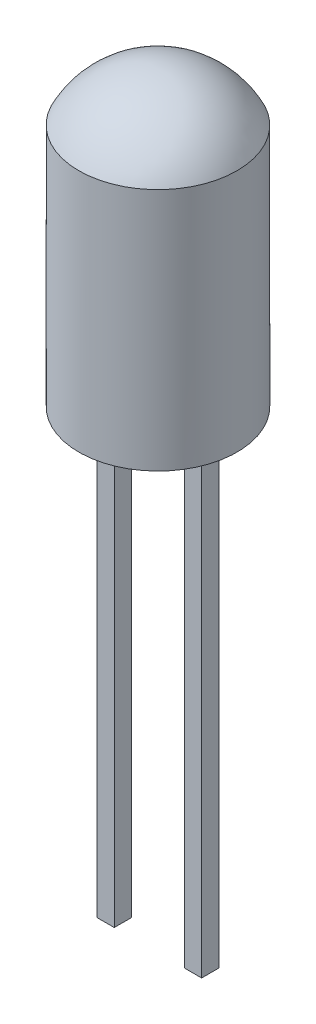
ISO-10303-21;
HEADER;
FILE_DESCRIPTION(('STEP AP214'),'2;1');
FILE_NAME('part.step','',(''),(''),'','','');
FILE_SCHEMA(('AUTOMOTIVE_DESIGN { 1 0 10303 214 1 1 1 1 }'));
ENDSEC;
DATA;
#1=APPLICATION_CONTEXT('core data for automotive mechanical design processes');
#2=APPLICATION_PROTOCOL_DEFINITION('international standard','automotive_design',2000,#1);
#3=PRODUCT_CONTEXT('',#1,'mechanical');
#4=PRODUCT('Part','Part','',(#3));
#5=PRODUCT_RELATED_PRODUCT_CATEGORY('part','',(#4));
#6=PRODUCT_DEFINITION_FORMATION('','',#4);
#7=PRODUCT_DEFINITION_CONTEXT('part definition',#1,'design');
#8=PRODUCT_DEFINITION('design','',#6,#7);
#9=PRODUCT_DEFINITION_SHAPE('','',#8);
#10=(LENGTH_UNIT() NAMED_UNIT(*) SI_UNIT(.MILLI.,.METRE.));
#11=(NAMED_UNIT(*) PLANE_ANGLE_UNIT() SI_UNIT($,.RADIAN.));
#12=(NAMED_UNIT(*) SI_UNIT($,.STERADIAN.) SOLID_ANGLE_UNIT());
#13=UNCERTAINTY_MEASURE_WITH_UNIT(LENGTH_MEASURE(1.E-05),#10,'distance_accuracy_value','');
#14=(GEOMETRIC_REPRESENTATION_CONTEXT(3) GLOBAL_UNCERTAINTY_ASSIGNED_CONTEXT((#13)) GLOBAL_UNIT_ASSIGNED_CONTEXT((#10,
#11,#12)) REPRESENTATION_CONTEXT('',''));
#15=CARTESIAN_POINT('',(0.,0.,0.));
#16=DIRECTION('',(0.,0.,1.));
#17=DIRECTION('',(1.,0.,0.));
#18=AXIS2_PLACEMENT_3D('',#15,#16,#17);
#19=CARTESIAN_POINT('',(0.,0.,0.));
#20=DIRECTION('',(0.,1.,0.));
#21=DIRECTION('',(-1.,0.,0.));
#22=AXIS2_PLACEMENT_3D('',#19,#20,#21);
#23=PLANE('',#22);
#24=DIRECTION('',(0.,0.,-1.));
#25=VECTOR('',#24,1.);
#26=CARTESIAN_POINT('',(-1.52,0.,0.25));
#27=LINE('',#26,#25);
#28=CARTESIAN_POINT('',(-1.52,0.,0.25));
#29=VERTEX_POINT('',#28);
#30=CARTESIAN_POINT('',(-1.52,0.,-0.25));
#31=VERTEX_POINT('',#30);
#32=EDGE_CURVE('E132',#29,#31,#27,.T.);
#33=ORIENTED_EDGE('',*,*,#32,.F.);
#34=DIRECTION('',(-1.,0.,0.));
#35=VECTOR('',#34,1.);
#36=CARTESIAN_POINT('',(-1.52,0.,0.25));
#37=LINE('',#36,#35);
#38=CARTESIAN_POINT('',(-1.02,0.,0.25));
#39=VERTEX_POINT('',#38);
#40=EDGE_CURVE('E145',#39,#29,#37,.T.);
#41=ORIENTED_EDGE('',*,*,#40,.F.);
#42=DIRECTION('',(0.,0.,1.));
#43=VECTOR('',#42,1.);
#44=CARTESIAN_POINT('',(-1.02,0.,0.25));
#45=LINE('',#44,#43);
#46=CARTESIAN_POINT('',(-1.02,0.,-0.25));
#47=VERTEX_POINT('',#46);
#48=EDGE_CURVE('E154',#47,#39,#45,.T.);
#49=ORIENTED_EDGE('',*,*,#48,.F.);
#50=DIRECTION('',(1.,0.,0.));
#51=VECTOR('',#50,1.);
#52=CARTESIAN_POINT('',(-1.52,0.,-0.25));
#53=LINE('',#52,#51);
#54=EDGE_CURVE('E135',#31,#47,#53,.T.);
#55=ORIENTED_EDGE('',*,*,#54,.F.);
#56=EDGE_LOOP('',(#33,#41,#49,#55));
#57=FACE_BOUND('',#56,.T.);
#58=CARTESIAN_POINT('',(0.,0.,0.));
#59=DIRECTION('',(0.,1.,0.));
#60=DIRECTION('',(-1.,0.,0.));
#61=AXIS2_PLACEMENT_3D('',#58,#59,#60);
#62=CIRCLE('',#61,2.29922369166117);
#63=CARTESIAN_POINT('',(-2.29922369166117,0.,0.));
#64=VERTEX_POINT('',#63);
#65=EDGE_CURVE('E54',#64,#64,#62,.T.);
#66=ORIENTED_EDGE('',*,*,#65,.F.);
#67=EDGE_LOOP('',(#66));
#68=FACE_BOUND('',#67,.T.);
#69=DIRECTION('',(0.,0.,-1.));
#70=VECTOR('',#69,1.);
#71=CARTESIAN_POINT('',(1.02,0.,0.25));
#72=LINE('',#71,#70);
#73=CARTESIAN_POINT('',(1.02,0.,0.25));
#74=VERTEX_POINT('',#73);
#75=CARTESIAN_POINT('',(1.02,0.,-0.25));
#76=VERTEX_POINT('',#75);
#77=EDGE_CURVE('E131',#74,#76,#72,.T.);
#78=ORIENTED_EDGE('',*,*,#77,.F.);
#79=DIRECTION('',(-1.,0.,0.));
#80=VECTOR('',#79,1.);
#81=CARTESIAN_POINT('',(1.52,0.,0.25));
#82=LINE('',#81,#80);
#83=CARTESIAN_POINT('',(1.52,0.,0.25));
#84=VERTEX_POINT('',#83);
#85=EDGE_CURVE('E128',#84,#74,#82,.T.);
#86=ORIENTED_EDGE('',*,*,#85,.F.);
#87=DIRECTION('',(0.,0.,1.));
#88=VECTOR('',#87,1.);
#89=CARTESIAN_POINT('',(1.52,0.,0.25));
#90=LINE('',#89,#88);
#91=CARTESIAN_POINT('',(1.52,0.,-0.25));
#92=VERTEX_POINT('',#91);
#93=EDGE_CURVE('E66',#92,#84,#90,.T.);
#94=ORIENTED_EDGE('',*,*,#93,.F.);
#95=DIRECTION('',(1.,0.,0.));
#96=VECTOR('',#95,1.);
#97=CARTESIAN_POINT('',(1.52,0.,-0.25));
#98=LINE('',#97,#96);
#99=EDGE_CURVE('E61',#76,#92,#98,.T.);
#100=ORIENTED_EDGE('',*,*,#99,.F.);
#101=EDGE_LOOP('',(#78,#86,#94,#100));
#102=FACE_BOUND('',#101,.T.);
#103=ADVANCED_FACE('F46',(#57,#68,#102),#23,.F.);
#104=CARTESIAN_POINT('',(0.,5.92517674435096,0.));
#105=DIRECTION('',(0.,1.,0.));
#106=DIRECTION('',(1.,0.,0.));
#107=AXIS2_PLACEMENT_3D('',#104,#105,#106);
#108=SPHERICAL_SURFACE('',#107,2.57482325564904);
#109=CARTESIAN_POINT('',(0.,7.08417856209548,0.));
#110=DIRECTION('',(0.,1.,0.));
#111=DIRECTION('',(-1.,0.,0.));
#112=AXIS2_PLACEMENT_3D('',#109,#110,#111);
#113=CIRCLE('',#112,2.29922369166117);
#114=CARTESIAN_POINT('',(-2.29922369166117,7.08417856209548,0.));
#115=VERTEX_POINT('',#114);
#116=EDGE_CURVE('E13',#115,#115,#113,.T.);
#117=ORIENTED_EDGE('',*,*,#116,.T.);
#118=EDGE_LOOP('',(#117));
#119=FACE_BOUND('',#118,.T.);
#120=ADVANCED_FACE('F48',(#119),#108,.T.);
#121=CARTESIAN_POINT('',(0.,8.5,0.));
#122=DIRECTION('',(0.,1.,0.));
#123=DIRECTION('',(-1.,0.,0.));
#124=AXIS2_PLACEMENT_3D('',#121,#122,#123);
#125=CYLINDRICAL_SURFACE('',#124,2.29922369166117);
#126=ORIENTED_EDGE('',*,*,#116,.F.);
#127=EDGE_LOOP('',(#126));
#128=FACE_BOUND('',#127,.T.);
#129=ORIENTED_EDGE('',*,*,#65,.T.);
#130=EDGE_LOOP('',(#129));
#131=FACE_BOUND('',#130,.T.);
#132=ADVANCED_FACE('F172',(#128,#131),#125,.T.);
#133=CARTESIAN_POINT('',(-1.52,-13.5,0.25));
#134=DIRECTION('',(1.,0.,0.));
#135=DIRECTION('',(0.,1.,0.));
#136=AXIS2_PLACEMENT_3D('',#133,#134,#135);
#137=PLANE('',#136);
#138=ORIENTED_EDGE('',*,*,#32,.T.);
#139=DIRECTION('',(0.,1.,0.));
#140=VECTOR('',#139,1.);
#141=CARTESIAN_POINT('',(-1.52,-13.5,-0.25));
#142=LINE('',#141,#140);
#143=CARTESIAN_POINT('',(-1.52,-13.5,-0.25));
#144=VERTEX_POINT('',#143);
#145=EDGE_CURVE('E167',#144,#31,#142,.T.);
#146=ORIENTED_EDGE('',*,*,#145,.F.);
#147=DIRECTION('',(0.,0.,-1.));
#148=VECTOR('',#147,1.);
#149=CARTESIAN_POINT('',(-1.52,-13.5,0.25));
#150=LINE('',#149,#148);
#151=CARTESIAN_POINT('',(-1.52,-13.5,0.25));
#152=VERTEX_POINT('',#151);
#153=EDGE_CURVE('E141',#152,#144,#150,.T.);
#154=ORIENTED_EDGE('',*,*,#153,.F.);
#155=DIRECTION('',(0.,1.,0.));
#156=VECTOR('',#155,1.);
#157=CARTESIAN_POINT('',(-1.52,-13.5,0.25));
#158=LINE('',#157,#156);
#159=EDGE_CURVE('E150',#152,#29,#158,.T.);
#160=ORIENTED_EDGE('',*,*,#159,.T.);
#161=EDGE_LOOP('',(#138,#146,#154,#160));
#162=FACE_BOUND('',#161,.T.);
#163=ADVANCED_FACE('F219',(#162),#137,.F.);
#164=CARTESIAN_POINT('',(-1.52,-13.5,-0.25));
#165=DIRECTION('',(0.,0.,1.));
#166=DIRECTION('',(1.,0.,0.));
#167=AXIS2_PLACEMENT_3D('',#164,#165,#166);
#168=PLANE('',#167);
#169=ORIENTED_EDGE('',*,*,#54,.T.);
#170=DIRECTION('',(0.,1.,0.));
#171=VECTOR('',#170,1.);
#172=CARTESIAN_POINT('',(-1.02,-13.5,-0.25));
#173=LINE('',#172,#171);
#174=CARTESIAN_POINT('',(-1.02,-13.5,-0.25));
#175=VERTEX_POINT('',#174);
#176=EDGE_CURVE('E164',#175,#47,#173,.T.);
#177=ORIENTED_EDGE('',*,*,#176,.F.);
#178=DIRECTION('',(1.,0.,0.));
#179=VECTOR('',#178,1.);
#180=CARTESIAN_POINT('',(-1.52,-13.5,-0.25));
#181=LINE('',#180,#179);
#182=EDGE_CURVE('E144',#144,#175,#181,.T.);
#183=ORIENTED_EDGE('',*,*,#182,.F.);
#184=ORIENTED_EDGE('',*,*,#145,.T.);
#185=EDGE_LOOP('',(#169,#177,#183,#184));
#186=FACE_BOUND('',#185,.T.);
#187=ADVANCED_FACE('F215',(#186),#168,.F.);
#188=CARTESIAN_POINT('',(-1.02,-13.5,0.25));
#189=DIRECTION('',(-1.,0.,0.));
#190=DIRECTION('',(0.,0.,1.));
#191=AXIS2_PLACEMENT_3D('',#188,#189,#190);
#192=PLANE('',#191);
#193=ORIENTED_EDGE('',*,*,#48,.T.);
#194=DIRECTION('',(0.,1.,0.));
#195=VECTOR('',#194,1.);
#196=CARTESIAN_POINT('',(-1.02,-13.5,0.25));
#197=LINE('',#196,#195);
#198=CARTESIAN_POINT('',(-1.02,-13.5,0.25));
#199=VERTEX_POINT('',#198);
#200=EDGE_CURVE('E161',#199,#39,#197,.T.);
#201=ORIENTED_EDGE('',*,*,#200,.F.);
#202=DIRECTION('',(0.,0.,1.));
#203=VECTOR('',#202,1.);
#204=CARTESIAN_POINT('',(-1.02,-13.5,0.25));
#205=LINE('',#204,#203);
#206=EDGE_CURVE('E147',#175,#199,#205,.T.);
#207=ORIENTED_EDGE('',*,*,#206,.F.);
#208=ORIENTED_EDGE('',*,*,#176,.T.);
#209=EDGE_LOOP('',(#193,#201,#207,#208));
#210=FACE_BOUND('',#209,.T.);
#211=ADVANCED_FACE('F211',(#210),#192,.F.);
#212=CARTESIAN_POINT('',(-1.52,-13.5,0.25));
#213=DIRECTION('',(0.,0.,-1.));
#214=DIRECTION('',(-1.,0.,0.));
#215=AXIS2_PLACEMENT_3D('',#212,#213,#214);
#216=PLANE('',#215);
#217=ORIENTED_EDGE('',*,*,#40,.T.);
#218=ORIENTED_EDGE('',*,*,#159,.F.);
#219=DIRECTION('',(-1.,0.,0.));
#220=VECTOR('',#219,1.);
#221=CARTESIAN_POINT('',(-1.52,-13.5,0.25));
#222=LINE('',#221,#220);
#223=EDGE_CURVE('E149',#199,#152,#222,.T.);
#224=ORIENTED_EDGE('',*,*,#223,.F.);
#225=ORIENTED_EDGE('',*,*,#200,.T.);
#226=EDGE_LOOP('',(#217,#218,#224,#225));
#227=FACE_BOUND('',#226,.T.);
#228=ADVANCED_FACE('F207',(#227),#216,.F.);
#229=CARTESIAN_POINT('',(-1.52,-13.5,-0.25));
#230=DIRECTION('',(0.,-1.,0.));
#231=DIRECTION('',(1.,0.,0.));
#232=AXIS2_PLACEMENT_3D('',#229,#230,#231);
#233=PLANE('',#232);
#234=ORIENTED_EDGE('',*,*,#153,.T.);
#235=ORIENTED_EDGE('',*,*,#182,.T.);
#236=ORIENTED_EDGE('',*,*,#206,.T.);
#237=ORIENTED_EDGE('',*,*,#223,.T.);
#238=EDGE_LOOP('',(#234,#235,#236,#237));
#239=FACE_BOUND('',#238,.T.);
#240=ADVANCED_FACE('F204',(#239),#233,.T.);
#241=CARTESIAN_POINT('',(1.02,-13.5,0.25));
#242=DIRECTION('',(1.,0.,0.));
#243=DIRECTION('',(0.,0.,-1.));
#244=AXIS2_PLACEMENT_3D('',#241,#242,#243);
#245=PLANE('',#244);
#246=ORIENTED_EDGE('',*,*,#77,.T.);
#247=DIRECTION('',(0.,1.,0.));
#248=VECTOR('',#247,1.);
#249=CARTESIAN_POINT('',(1.02,-13.5,-0.25));
#250=LINE('',#249,#248);
#251=CARTESIAN_POINT('',(1.02,-13.5,-0.25));
#252=VERTEX_POINT('',#251);
#253=EDGE_CURVE('E112',#252,#76,#250,.T.);
#254=ORIENTED_EDGE('',*,*,#253,.F.);
#255=DIRECTION('',(0.,0.,-1.));
#256=VECTOR('',#255,1.);
#257=CARTESIAN_POINT('',(1.02,-13.5,0.25));
#258=LINE('',#257,#256);
#259=CARTESIAN_POINT('',(1.02,-13.5,0.25));
#260=VERTEX_POINT('',#259);
#261=EDGE_CURVE('E119',#260,#252,#258,.T.);
#262=ORIENTED_EDGE('',*,*,#261,.F.);
#263=DIRECTION('',(0.,1.,0.));
#264=VECTOR('',#263,1.);
#265=CARTESIAN_POINT('',(1.02,-13.5,0.25));
#266=LINE('',#265,#264);
#267=EDGE_CURVE('E182',#260,#74,#266,.T.);
#268=ORIENTED_EDGE('',*,*,#267,.T.);
#269=EDGE_LOOP('',(#246,#254,#262,#268));
#270=FACE_BOUND('',#269,.T.);
#271=ADVANCED_FACE('F130',(#270),#245,.F.);
#272=CARTESIAN_POINT('',(1.52,-13.5,-0.25));
#273=DIRECTION('',(0.,0.,1.));
#274=DIRECTION('',(1.,0.,0.));
#275=AXIS2_PLACEMENT_3D('',#272,#273,#274);
#276=PLANE('',#275);
#277=ORIENTED_EDGE('',*,*,#99,.T.);
#278=DIRECTION('',(0.,1.,0.));
#279=VECTOR('',#278,1.);
#280=CARTESIAN_POINT('',(1.52,-13.5,-0.25));
#281=LINE('',#280,#279);
#282=CARTESIAN_POINT('',(1.52,-13.5,-0.25));
#283=VERTEX_POINT('',#282);
#284=EDGE_CURVE('E115',#283,#92,#281,.T.);
#285=ORIENTED_EDGE('',*,*,#284,.F.);
#286=DIRECTION('',(1.,0.,0.));
#287=VECTOR('',#286,1.);
#288=CARTESIAN_POINT('',(1.52,-13.5,-0.25));
#289=LINE('',#288,#287);
#290=EDGE_CURVE('E108',#252,#283,#289,.T.);
#291=ORIENTED_EDGE('',*,*,#290,.F.);
#292=ORIENTED_EDGE('',*,*,#253,.T.);
#293=EDGE_LOOP('',(#277,#285,#291,#292));
#294=FACE_BOUND('',#293,.T.);
#295=ADVANCED_FACE('F110',(#294),#276,.F.);
#296=CARTESIAN_POINT('',(1.52,-13.5,0.25));
#297=DIRECTION('',(-1.,0.,0.));
#298=DIRECTION('',(0.,-1.,0.));
#299=AXIS2_PLACEMENT_3D('',#296,#297,#298);
#300=PLANE('',#299);
#301=ORIENTED_EDGE('',*,*,#93,.T.);
#302=DIRECTION('',(0.,1.,0.));
#303=VECTOR('',#302,1.);
#304=CARTESIAN_POINT('',(1.52,-13.5,0.25));
#305=LINE('',#304,#303);
#306=CARTESIAN_POINT('',(1.52,-13.5,0.25));
#307=VERTEX_POINT('',#306);
#308=EDGE_CURVE('E137',#307,#84,#305,.T.);
#309=ORIENTED_EDGE('',*,*,#308,.F.);
#310=DIRECTION('',(0.,0.,1.));
#311=VECTOR('',#310,1.);
#312=CARTESIAN_POINT('',(1.52,-13.5,0.25));
#313=LINE('',#312,#311);
#314=EDGE_CURVE('E118',#283,#307,#313,.T.);
#315=ORIENTED_EDGE('',*,*,#314,.F.);
#316=ORIENTED_EDGE('',*,*,#284,.T.);
#317=EDGE_LOOP('',(#301,#309,#315,#316));
#318=FACE_BOUND('',#317,.T.);
#319=ADVANCED_FACE('F191',(#318),#300,.F.);
#320=CARTESIAN_POINT('',(1.52,-13.5,0.25));
#321=DIRECTION('',(0.,0.,-1.));
#322=DIRECTION('',(-1.,0.,0.));
#323=AXIS2_PLACEMENT_3D('',#320,#321,#322);
#324=PLANE('',#323);
#325=ORIENTED_EDGE('',*,*,#85,.T.);
#326=ORIENTED_EDGE('',*,*,#267,.F.);
#327=DIRECTION('',(-1.,0.,0.));
#328=VECTOR('',#327,1.);
#329=CARTESIAN_POINT('',(1.52,-13.5,0.25));
#330=LINE('',#329,#328);
#331=EDGE_CURVE('E124',#307,#260,#330,.T.);
#332=ORIENTED_EDGE('',*,*,#331,.F.);
#333=ORIENTED_EDGE('',*,*,#308,.T.);
#334=EDGE_LOOP('',(#325,#326,#332,#333));
#335=FACE_BOUND('',#334,.T.);
#336=ADVANCED_FACE('F181',(#335),#324,.F.);
#337=CARTESIAN_POINT('',(1.02,-13.5,-0.25));
#338=DIRECTION('',(0.,1.,0.));
#339=DIRECTION('',(-1.,0.,0.));
#340=AXIS2_PLACEMENT_3D('',#337,#338,#339);
#341=PLANE('',#340);
#342=ORIENTED_EDGE('',*,*,#261,.T.);
#343=ORIENTED_EDGE('',*,*,#290,.T.);
#344=ORIENTED_EDGE('',*,*,#314,.T.);
#345=ORIENTED_EDGE('',*,*,#331,.T.);
#346=EDGE_LOOP('',(#342,#343,#344,#345));
#347=FACE_BOUND('',#346,.T.);
#348=ADVANCED_FACE('F122',(#347),#341,.F.);
#349=CLOSED_SHELL('',(#103,#120,#132,#163,#187,#211,#228,#240,#271,#295,#319,#336,#348));
#350=MANIFOLD_SOLID_BREP('B2',#349);
#351=ADVANCED_BREP_SHAPE_REPRESENTATION('',(#18,#350),#14);
#352=SHAPE_DEFINITION_REPRESENTATION(#9,#351);
ENDSEC;
END-ISO-10303-21;
